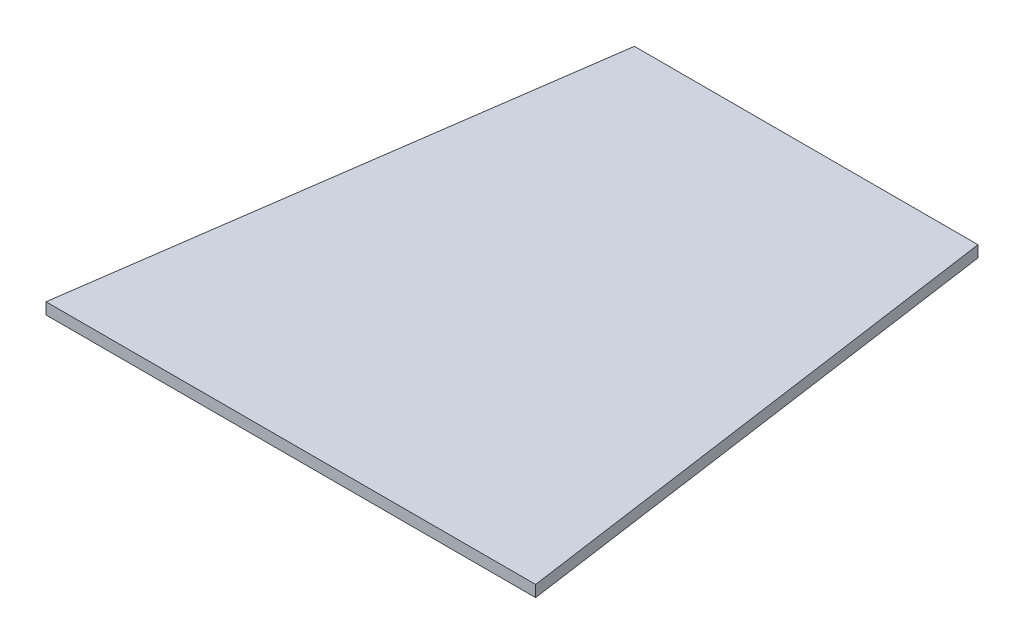
ISO-10303-21;
HEADER;
FILE_DESCRIPTION(('STEP AP214'),'2;1');
FILE_NAME('part.step','',(''),(''),'','','');
FILE_SCHEMA(('AUTOMOTIVE_DESIGN { 1 0 10303 214 1 1 1 1 }'));
ENDSEC;
DATA;
#1=APPLICATION_CONTEXT('core data for automotive mechanical design processes');
#2=APPLICATION_PROTOCOL_DEFINITION('international standard','automotive_design',2000,#1);
#3=PRODUCT_CONTEXT('',#1,'mechanical');
#4=PRODUCT('Part','Part','',(#3));
#5=PRODUCT_RELATED_PRODUCT_CATEGORY('part','',(#4));
#6=PRODUCT_DEFINITION_FORMATION('','',#4);
#7=PRODUCT_DEFINITION_CONTEXT('part definition',#1,'design');
#8=PRODUCT_DEFINITION('design','',#6,#7);
#9=PRODUCT_DEFINITION_SHAPE('','',#8);
#10=(LENGTH_UNIT() NAMED_UNIT(*) SI_UNIT(.MILLI.,.METRE.));
#11=(NAMED_UNIT(*) PLANE_ANGLE_UNIT() SI_UNIT($,.RADIAN.));
#12=(NAMED_UNIT(*) SI_UNIT($,.STERADIAN.) SOLID_ANGLE_UNIT());
#13=UNCERTAINTY_MEASURE_WITH_UNIT(LENGTH_MEASURE(1.E-05),#10,'distance_accuracy_value','');
#14=(GEOMETRIC_REPRESENTATION_CONTEXT(3) GLOBAL_UNCERTAINTY_ASSIGNED_CONTEXT((#13)) GLOBAL_UNIT_ASSIGNED_CONTEXT((#10,
#11,#12)) REPRESENTATION_CONTEXT('',''));
#15=CARTESIAN_POINT('',(0.,0.,0.));
#16=DIRECTION('',(0.,0.,1.));
#17=DIRECTION('',(1.,0.,0.));
#18=AXIS2_PLACEMENT_3D('',#15,#16,#17);
#19=CARTESIAN_POINT('',(30.,2.,-89.9999999999999));
#20=DIRECTION('',(-0.990113838694715,0.,0.140266127148418));
#21=DIRECTION('',(0.140266127148418,0.,0.990113838694715));
#22=AXIS2_PLACEMENT_3D('',#19,#20,#21);
#23=PLANE('',#22);
#24=DIRECTION('',(-0.140266127148418,0.,-0.990113838694715));
#25=VECTOR('',#24,1.);
#26=CARTESIAN_POINT('',(30.,0.,-89.9999999999999));
#27=LINE('',#26,#25);
#28=CARTESIAN_POINT('',(42.75,0.,0.));
#29=VERTEX_POINT('',#28);
#30=CARTESIAN_POINT('',(30.,0.,-89.9999999999999));
#31=VERTEX_POINT('',#30);
#32=EDGE_CURVE('E102',#29,#31,#27,.T.);
#33=ORIENTED_EDGE('',*,*,#32,.T.);
#34=DIRECTION('',(0.,-1.,0.));
#35=VECTOR('',#34,1.);
#36=CARTESIAN_POINT('',(30.,2.,-89.9999999999999));
#37=LINE('',#36,#35);
#38=CARTESIAN_POINT('',(30.,2.,-89.9999999999999));
#39=VERTEX_POINT('',#38);
#40=EDGE_CURVE('E11',#39,#31,#37,.T.);
#41=ORIENTED_EDGE('',*,*,#40,.F.);
#42=DIRECTION('',(-0.140266127148418,0.,-0.990113838694715));
#43=VECTOR('',#42,1.);
#44=CARTESIAN_POINT('',(30.,2.,-89.9999999999999));
#45=LINE('',#44,#43);
#46=CARTESIAN_POINT('',(42.75,2.,0.));
#47=VERTEX_POINT('',#46);
#48=EDGE_CURVE('E90',#47,#39,#45,.T.);
#49=ORIENTED_EDGE('',*,*,#48,.F.);
#50=DIRECTION('',(0.,-1.,0.));
#51=VECTOR('',#50,1.);
#52=CARTESIAN_POINT('',(42.75,2.,0.));
#53=LINE('',#52,#51);
#54=EDGE_CURVE('E98',#47,#29,#53,.T.);
#55=ORIENTED_EDGE('',*,*,#54,.T.);
#56=EDGE_LOOP('',(#33,#41,#49,#55));
#57=FACE_BOUND('',#56,.T.);
#58=ADVANCED_FACE('F39',(#57),#23,.F.);
#59=CARTESIAN_POINT('',(30.,2.,-89.9999999999999));
#60=DIRECTION('',(0.,0.,1.));
#61=DIRECTION('',(1.,0.,0.));
#62=AXIS2_PLACEMENT_3D('',#59,#60,#61);
#63=PLANE('',#62);
#64=DIRECTION('',(-1.,0.,0.));
#65=VECTOR('',#64,1.);
#66=CARTESIAN_POINT('',(30.,0.,-89.9999999999999));
#67=LINE('',#66,#65);
#68=CARTESIAN_POINT('',(-30.,0.,-90.));
#69=VERTEX_POINT('',#68);
#70=EDGE_CURVE('E94',#31,#69,#67,.T.);
#71=ORIENTED_EDGE('',*,*,#70,.T.);
#72=DIRECTION('',(0.,-1.,0.));
#73=VECTOR('',#72,1.);
#74=CARTESIAN_POINT('',(-30.,2.,-90.));
#75=LINE('',#74,#73);
#76=CARTESIAN_POINT('',(-30.,2.,-90.));
#77=VERTEX_POINT('',#76);
#78=EDGE_CURVE('E47',#77,#69,#75,.T.);
#79=ORIENTED_EDGE('',*,*,#78,.F.);
#80=DIRECTION('',(-1.,0.,0.));
#81=VECTOR('',#80,1.);
#82=CARTESIAN_POINT('',(30.,2.,-89.9999999999999));
#83=LINE('',#82,#81);
#84=EDGE_CURVE('E85',#39,#77,#83,.T.);
#85=ORIENTED_EDGE('',*,*,#84,.F.);
#86=ORIENTED_EDGE('',*,*,#40,.T.);
#87=EDGE_LOOP('',(#71,#79,#85,#86));
#88=FACE_BOUND('',#87,.T.);
#89=ADVANCED_FACE('F93',(#88),#63,.F.);
#90=CARTESIAN_POINT('',(-30.,2.,-90.));
#91=DIRECTION('',(0.990113838694715,0.,0.140266127148418));
#92=DIRECTION('',(0.140266127148418,0.,-0.990113838694715));
#93=AXIS2_PLACEMENT_3D('',#90,#91,#92);
#94=PLANE('',#93);
#95=DIRECTION('',(-0.140266127148418,0.,0.990113838694715));
#96=VECTOR('',#95,1.);
#97=CARTESIAN_POINT('',(-30.,0.,-90.));
#98=LINE('',#97,#96);
#99=CARTESIAN_POINT('',(-42.75,0.,0.));
#100=VERTEX_POINT('',#99);
#101=EDGE_CURVE('E72',#69,#100,#98,.T.);
#102=ORIENTED_EDGE('',*,*,#101,.T.);
#103=DIRECTION('',(0.,-1.,0.));
#104=VECTOR('',#103,1.);
#105=CARTESIAN_POINT('',(-42.75,2.,0.));
#106=LINE('',#105,#104);
#107=CARTESIAN_POINT('',(-42.75,2.,0.));
#108=VERTEX_POINT('',#107);
#109=EDGE_CURVE('E95',#108,#100,#106,.T.);
#110=ORIENTED_EDGE('',*,*,#109,.F.);
#111=DIRECTION('',(-0.140266127148418,0.,0.990113838694715));
#112=VECTOR('',#111,1.);
#113=CARTESIAN_POINT('',(-30.,2.,-90.));
#114=LINE('',#113,#112);
#115=EDGE_CURVE('E88',#77,#108,#114,.T.);
#116=ORIENTED_EDGE('',*,*,#115,.F.);
#117=ORIENTED_EDGE('',*,*,#78,.T.);
#118=EDGE_LOOP('',(#102,#110,#116,#117));
#119=FACE_BOUND('',#118,.T.);
#120=ADVANCED_FACE('F96',(#119),#94,.F.);
#121=CARTESIAN_POINT('',(-42.75,2.,0.));
#122=DIRECTION('',(0.,0.,-1.));
#123=DIRECTION('',(-1.,0.,0.));
#124=AXIS2_PLACEMENT_3D('',#121,#122,#123);
#125=PLANE('',#124);
#126=DIRECTION('',(1.,0.,0.));
#127=VECTOR('',#126,1.);
#128=CARTESIAN_POINT('',(-42.75,0.,0.));
#129=LINE('',#128,#127);
#130=EDGE_CURVE('E78',#100,#29,#129,.T.);
#131=ORIENTED_EDGE('',*,*,#130,.T.);
#132=ORIENTED_EDGE('',*,*,#54,.F.);
#133=DIRECTION('',(1.,0.,0.));
#134=VECTOR('',#133,1.);
#135=CARTESIAN_POINT('',(-42.75,2.,0.));
#136=LINE('',#135,#134);
#137=EDGE_CURVE('E55',#108,#47,#136,.T.);
#138=ORIENTED_EDGE('',*,*,#137,.F.);
#139=ORIENTED_EDGE('',*,*,#109,.T.);
#140=EDGE_LOOP('',(#131,#132,#138,#139));
#141=FACE_BOUND('',#140,.T.);
#142=ADVANCED_FACE('F109',(#141),#125,.F.);
#143=CARTESIAN_POINT('',(0.,2.,0.));
#144=DIRECTION('',(0.,1.,0.));
#145=DIRECTION('',(0.,0.,1.));
#146=AXIS2_PLACEMENT_3D('',#143,#144,#145);
#147=PLANE('',#146);
#148=ORIENTED_EDGE('',*,*,#48,.T.);
#149=ORIENTED_EDGE('',*,*,#84,.T.);
#150=ORIENTED_EDGE('',*,*,#115,.T.);
#151=ORIENTED_EDGE('',*,*,#137,.T.);
#152=EDGE_LOOP('',(#148,#149,#150,#151));
#153=FACE_BOUND('',#152,.T.);
#154=ADVANCED_FACE('F86',(#153),#147,.T.);
#155=CARTESIAN_POINT('',(0.,0.,0.));
#156=DIRECTION('',(0.,1.,0.));
#157=DIRECTION('',(0.,0.,1.));
#158=AXIS2_PLACEMENT_3D('',#155,#156,#157);
#159=PLANE('',#158);
#160=ORIENTED_EDGE('',*,*,#32,.F.);
#161=ORIENTED_EDGE('',*,*,#130,.F.);
#162=ORIENTED_EDGE('',*,*,#101,.F.);
#163=ORIENTED_EDGE('',*,*,#70,.F.);
#164=EDGE_LOOP('',(#160,#161,#162,#163));
#165=FACE_BOUND('',#164,.T.);
#166=ADVANCED_FACE('F112',(#165),#159,.F.);
#167=CLOSED_SHELL('',(#58,#89,#120,#142,#154,#166));
#168=MANIFOLD_SOLID_BREP('B2',#167);
#169=ADVANCED_BREP_SHAPE_REPRESENTATION('',(#18,#168),#14);
#170=SHAPE_DEFINITION_REPRESENTATION(#9,#169);
ENDSEC;
END-ISO-10303-21;
